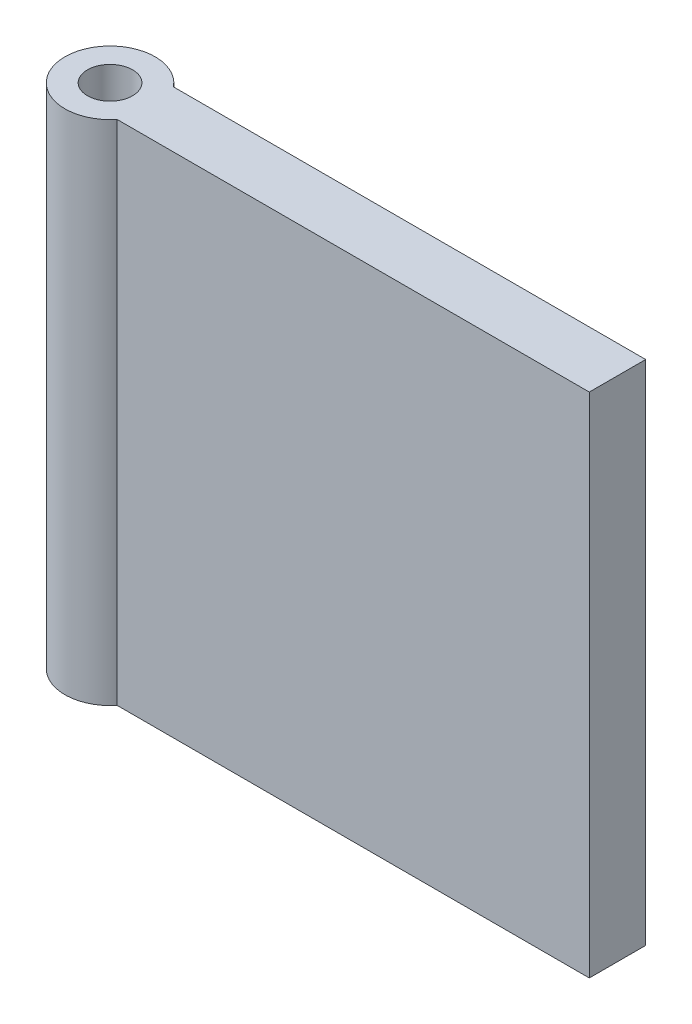
ISO-10303-21;
HEADER;
FILE_DESCRIPTION(('STEP AP214'),'2;1');
FILE_NAME('part.step','',(''),(''),'','','');
FILE_SCHEMA(('AUTOMOTIVE_DESIGN { 1 0 10303 214 1 1 1 1 }'));
ENDSEC;
DATA;
#1=APPLICATION_CONTEXT('core data for automotive mechanical design processes');
#2=APPLICATION_PROTOCOL_DEFINITION('international standard','automotive_design',2000,#1);
#3=PRODUCT_CONTEXT('',#1,'mechanical');
#4=PRODUCT('Part','Part','',(#3));
#5=PRODUCT_RELATED_PRODUCT_CATEGORY('part','',(#4));
#6=PRODUCT_DEFINITION_FORMATION('','',#4);
#7=PRODUCT_DEFINITION_CONTEXT('part definition',#1,'design');
#8=PRODUCT_DEFINITION('design','',#6,#7);
#9=PRODUCT_DEFINITION_SHAPE('','',#8);
#10=(LENGTH_UNIT() NAMED_UNIT(*) SI_UNIT(.MILLI.,.METRE.));
#11=(NAMED_UNIT(*) PLANE_ANGLE_UNIT() SI_UNIT($,.RADIAN.));
#12=(NAMED_UNIT(*) SI_UNIT($,.STERADIAN.) SOLID_ANGLE_UNIT());
#13=UNCERTAINTY_MEASURE_WITH_UNIT(LENGTH_MEASURE(1.E-05),#10,'distance_accuracy_value','');
#14=(GEOMETRIC_REPRESENTATION_CONTEXT(3) GLOBAL_UNCERTAINTY_ASSIGNED_CONTEXT((#13)) GLOBAL_UNIT_ASSIGNED_CONTEXT((#10,
#11,#12)) REPRESENTATION_CONTEXT('',''));
#15=CARTESIAN_POINT('',(0.,0.,0.));
#16=DIRECTION('',(0.,0.,1.));
#17=DIRECTION('',(1.,0.,0.));
#18=AXIS2_PLACEMENT_3D('',#15,#16,#17);
#19=CARTESIAN_POINT('',(0.,45.,-2.5));
#20=DIRECTION('',(0.,0.,1.));
#21=DIRECTION('',(1.,0.,0.));
#22=AXIS2_PLACEMENT_3D('',#19,#20,#21);
#23=PLANE('',#22);
#24=DIRECTION('',(-1.,0.,0.));
#25=VECTOR('',#24,1.);
#26=CARTESIAN_POINT('',(0.,0.,-2.5));
#27=LINE('',#26,#25);
#28=CARTESIAN_POINT('',(45.,0.,-2.50000000000001));
#29=VERTEX_POINT('',#28);
#30=CARTESIAN_POINT('',(3.1224989991992,0.,-2.5));
#31=VERTEX_POINT('',#30);
#32=EDGE_CURVE('E98',#29,#31,#27,.T.);
#33=ORIENTED_EDGE('',*,*,#32,.T.);
#34=DIRECTION('',(0.,-1.,0.));
#35=VECTOR('',#34,1.);
#36=CARTESIAN_POINT('',(3.1224989991992,45.,-2.5));
#37=LINE('',#36,#35);
#38=CARTESIAN_POINT('',(3.1224989991992,45.,-2.5));
#39=VERTEX_POINT('',#38);
#40=EDGE_CURVE('E11',#39,#31,#37,.T.);
#41=ORIENTED_EDGE('',*,*,#40,.F.);
#42=DIRECTION('',(-1.,0.,0.));
#43=VECTOR('',#42,1.);
#44=CARTESIAN_POINT('',(0.,45.,-2.5));
#45=LINE('',#44,#43);
#46=CARTESIAN_POINT('',(45.,45.,-2.50000000000001));
#47=VERTEX_POINT('',#46);
#48=EDGE_CURVE('E83',#47,#39,#45,.T.);
#49=ORIENTED_EDGE('',*,*,#48,.F.);
#50=DIRECTION('',(0.,-1.,0.));
#51=VECTOR('',#50,1.);
#52=CARTESIAN_POINT('',(45.,45.,-2.50000000000001));
#53=LINE('',#52,#51);
#54=EDGE_CURVE('E94',#47,#29,#53,.T.);
#55=ORIENTED_EDGE('',*,*,#54,.T.);
#56=EDGE_LOOP('',(#33,#41,#49,#55));
#57=FACE_BOUND('',#56,.T.);
#58=ADVANCED_FACE('F36',(#57),#23,.F.);
#59=CARTESIAN_POINT('',(0.,45.,0.));
#60=DIRECTION('',(0.,-1.,0.));
#61=DIRECTION('',(0.,0.,-1.));
#62=AXIS2_PLACEMENT_3D('',#59,#60,#61);
#63=CYLINDRICAL_SURFACE('',#62,4.);
#64=CARTESIAN_POINT('',(0.,0.,0.));
#65=DIRECTION('',(0.,1.,0.));
#66=DIRECTION('',(0.,0.,1.));
#67=AXIS2_PLACEMENT_3D('',#64,#65,#66);
#68=CIRCLE('',#67,4.);
#69=CARTESIAN_POINT('',(3.1224989991992,0.,2.5));
#70=VERTEX_POINT('',#69);
#71=EDGE_CURVE('E88',#31,#70,#68,.T.);
#72=ORIENTED_EDGE('',*,*,#71,.T.);
#73=DIRECTION('',(0.,-1.,0.));
#74=VECTOR('',#73,1.);
#75=CARTESIAN_POINT('',(3.1224989991992,45.,2.5));
#76=LINE('',#75,#74);
#77=CARTESIAN_POINT('',(3.1224989991992,45.,2.5));
#78=VERTEX_POINT('',#77);
#79=EDGE_CURVE('E44',#78,#70,#76,.T.);
#80=ORIENTED_EDGE('',*,*,#79,.F.);
#81=CARTESIAN_POINT('',(0.,45.,0.));
#82=DIRECTION('',(0.,1.,0.));
#83=DIRECTION('',(0.,0.,1.));
#84=AXIS2_PLACEMENT_3D('',#81,#82,#83);
#85=CIRCLE('',#84,4.);
#86=EDGE_CURVE('E78',#39,#78,#85,.T.);
#87=ORIENTED_EDGE('',*,*,#86,.F.);
#88=ORIENTED_EDGE('',*,*,#40,.T.);
#89=EDGE_LOOP('',(#72,#80,#87,#88));
#90=FACE_BOUND('',#89,.T.);
#91=ADVANCED_FACE('F87',(#90),#63,.T.);
#92=CARTESIAN_POINT('',(0.,45.,2.5));
#93=DIRECTION('',(0.,0.,1.));
#94=DIRECTION('',(1.,0.,0.));
#95=AXIS2_PLACEMENT_3D('',#92,#93,#94);
#96=PLANE('',#95);
#97=DIRECTION('',(-1.,0.,0.));
#98=VECTOR('',#97,1.);
#99=CARTESIAN_POINT('',(0.,0.,2.5));
#100=LINE('',#99,#98);
#101=CARTESIAN_POINT('',(45.,0.,2.49999999999999));
#102=VERTEX_POINT('',#101);
#103=EDGE_CURVE('E103',#102,#70,#100,.T.);
#104=ORIENTED_EDGE('',*,*,#103,.F.);
#105=DIRECTION('',(0.,-1.,0.));
#106=VECTOR('',#105,1.);
#107=CARTESIAN_POINT('',(45.,45.,2.49999999999999));
#108=LINE('',#107,#106);
#109=CARTESIAN_POINT('',(45.,45.,2.49999999999999));
#110=VERTEX_POINT('',#109);
#111=EDGE_CURVE('E68',#110,#102,#108,.T.);
#112=ORIENTED_EDGE('',*,*,#111,.F.);
#113=DIRECTION('',(-1.,0.,0.));
#114=VECTOR('',#113,1.);
#115=CARTESIAN_POINT('',(0.,45.,2.5));
#116=LINE('',#115,#114);
#117=EDGE_CURVE('E81',#110,#78,#116,.T.);
#118=ORIENTED_EDGE('',*,*,#117,.T.);
#119=ORIENTED_EDGE('',*,*,#79,.T.);
#120=EDGE_LOOP('',(#104,#112,#118,#119));
#121=FACE_BOUND('',#120,.T.);
#122=ADVANCED_FACE('F92',(#121),#96,.T.);
#123=CARTESIAN_POINT('',(45.,45.,0.));
#124=DIRECTION('',(-1.,0.,0.));
#125=DIRECTION('',(0.,0.,1.));
#126=AXIS2_PLACEMENT_3D('',#123,#124,#125);
#127=PLANE('',#126);
#128=DIRECTION('',(0.,0.,-1.));
#129=VECTOR('',#128,1.);
#130=CARTESIAN_POINT('',(45.,0.,0.));
#131=LINE('',#130,#129);
#132=EDGE_CURVE('E71',#102,#29,#131,.T.);
#133=ORIENTED_EDGE('',*,*,#132,.T.);
#134=ORIENTED_EDGE('',*,*,#54,.F.);
#135=DIRECTION('',(0.,0.,-1.));
#136=VECTOR('',#135,1.);
#137=CARTESIAN_POINT('',(45.,45.,0.));
#138=LINE('',#137,#136);
#139=EDGE_CURVE('E52',#110,#47,#138,.T.);
#140=ORIENTED_EDGE('',*,*,#139,.F.);
#141=ORIENTED_EDGE('',*,*,#111,.T.);
#142=EDGE_LOOP('',(#133,#134,#140,#141));
#143=FACE_BOUND('',#142,.T.);
#144=ADVANCED_FACE('F121',(#143),#127,.F.);
#145=CARTESIAN_POINT('',(0.,45.,0.));
#146=DIRECTION('',(0.,1.,0.));
#147=DIRECTION('',(0.,0.,1.));
#148=AXIS2_PLACEMENT_3D('',#145,#146,#147);
#149=PLANE('',#148);
#150=CARTESIAN_POINT('',(0.,45.,0.));
#151=DIRECTION('',(0.,1.,0.));
#152=DIRECTION('',(0.,0.,1.));
#153=AXIS2_PLACEMENT_3D('',#150,#151,#152);
#154=CIRCLE('',#153,2.);
#155=CARTESIAN_POINT('',(0.,45.,2.));
#156=VERTEX_POINT('',#155);
#157=EDGE_CURVE('E184',#156,#156,#154,.T.);
#158=ORIENTED_EDGE('',*,*,#157,.F.);
#159=EDGE_LOOP('',(#158));
#160=FACE_BOUND('',#159,.T.);
#161=ORIENTED_EDGE('',*,*,#48,.T.);
#162=ORIENTED_EDGE('',*,*,#86,.T.);
#163=ORIENTED_EDGE('',*,*,#117,.F.);
#164=ORIENTED_EDGE('',*,*,#139,.T.);
#165=EDGE_LOOP('',(#161,#162,#163,#164));
#166=FACE_BOUND('',#165,.T.);
#167=ADVANCED_FACE('F79',(#160,#166),#149,.T.);
#168=CARTESIAN_POINT('',(0.,0.,0.));
#169=DIRECTION('',(0.,1.,0.));
#170=DIRECTION('',(0.,0.,1.));
#171=AXIS2_PLACEMENT_3D('',#168,#169,#170);
#172=PLANE('',#171);
#173=CARTESIAN_POINT('',(0.,0.,0.));
#174=DIRECTION('',(0.,1.,0.));
#175=DIRECTION('',(0.,0.,1.));
#176=AXIS2_PLACEMENT_3D('',#173,#174,#175);
#177=CIRCLE('',#176,2.);
#178=CARTESIAN_POINT('',(0.,0.,2.));
#179=VERTEX_POINT('',#178);
#180=EDGE_CURVE('E101',#179,#179,#177,.T.);
#181=ORIENTED_EDGE('',*,*,#180,.T.);
#182=EDGE_LOOP('',(#181));
#183=FACE_BOUND('',#182,.T.);
#184=ORIENTED_EDGE('',*,*,#32,.F.);
#185=ORIENTED_EDGE('',*,*,#132,.F.);
#186=ORIENTED_EDGE('',*,*,#103,.T.);
#187=ORIENTED_EDGE('',*,*,#71,.F.);
#188=EDGE_LOOP('',(#184,#185,#186,#187));
#189=FACE_BOUND('',#188,.T.);
#190=ADVANCED_FACE('F110',(#183,#189),#172,.F.);
#191=CARTESIAN_POINT('',(0.,0.,0.));
#192=DIRECTION('',(0.,1.,0.));
#193=DIRECTION('',(0.,0.,1.));
#194=AXIS2_PLACEMENT_3D('',#191,#192,#193);
#195=CYLINDRICAL_SURFACE('',#194,2.);
#196=CARTESIAN_POINT('',(0.,0.,2.));
#197=CARTESIAN_POINT('',(0.,0.468749999999999,2.));
#198=CARTESIAN_POINT('',(0.,0.9375,2.));
#199=CARTESIAN_POINT('',(0.,1.875,2.));
#200=CARTESIAN_POINT('',(0.,2.34375,2.));
#201=CARTESIAN_POINT('',(0.,3.28125,2.));
#202=CARTESIAN_POINT('',(0.,3.75,2.));
#203=CARTESIAN_POINT('',(0.,4.6875,2.));
#204=CARTESIAN_POINT('',(0.,5.15625,2.));
#205=CARTESIAN_POINT('',(0.,6.09375,2.));
#206=CARTESIAN_POINT('',(0.,6.5625,2.));
#207=CARTESIAN_POINT('',(0.,7.5,2.));
#208=CARTESIAN_POINT('',(0.,7.96875,2.));
#209=CARTESIAN_POINT('',(0.,8.90625,2.));
#210=CARTESIAN_POINT('',(0.,9.375,2.));
#211=CARTESIAN_POINT('',(0.,10.3125,2.));
#212=CARTESIAN_POINT('',(0.,10.78125,2.));
#213=CARTESIAN_POINT('',(0.,11.71875,2.));
#214=CARTESIAN_POINT('',(0.,12.1875,2.));
#215=CARTESIAN_POINT('',(0.,13.125,2.));
#216=CARTESIAN_POINT('',(0.,13.59375,2.));
#217=CARTESIAN_POINT('',(0.,14.53125,2.));
#218=CARTESIAN_POINT('',(0.,15.,2.));
#219=CARTESIAN_POINT('',(0.,15.9375,2.));
#220=CARTESIAN_POINT('',(0.,16.40625,2.));
#221=CARTESIAN_POINT('',(0.,17.34375,2.));
#222=CARTESIAN_POINT('',(0.,17.8125,2.));
#223=CARTESIAN_POINT('',(0.,18.75,2.));
#224=CARTESIAN_POINT('',(0.,19.21875,2.));
#225=CARTESIAN_POINT('',(0.,20.15625,2.));
#226=CARTESIAN_POINT('',(0.,20.625,2.));
#227=CARTESIAN_POINT('',(0.,21.5625,2.));
#228=CARTESIAN_POINT('',(0.,22.03125,2.));
#229=CARTESIAN_POINT('',(0.,22.96875,2.));
#230=CARTESIAN_POINT('',(0.,23.4375,2.));
#231=CARTESIAN_POINT('',(0.,24.375,2.));
#232=CARTESIAN_POINT('',(0.,24.84375,2.));
#233=CARTESIAN_POINT('',(0.,25.78125,2.));
#234=CARTESIAN_POINT('',(0.,26.25,2.));
#235=CARTESIAN_POINT('',(0.,27.1875,2.));
#236=CARTESIAN_POINT('',(0.,27.65625,2.));
#237=CARTESIAN_POINT('',(0.,28.59375,2.));
#238=CARTESIAN_POINT('',(0.,29.0625,2.));
#239=CARTESIAN_POINT('',(0.,30.,2.));
#240=CARTESIAN_POINT('',(0.,30.46875,2.));
#241=CARTESIAN_POINT('',(0.,31.40625,2.));
#242=CARTESIAN_POINT('',(0.,31.875,2.));
#243=CARTESIAN_POINT('',(0.,32.8125,2.));
#244=CARTESIAN_POINT('',(0.,33.28125,2.));
#245=CARTESIAN_POINT('',(0.,34.21875,2.));
#246=CARTESIAN_POINT('',(0.,34.6875,2.));
#247=CARTESIAN_POINT('',(0.,35.625,2.));
#248=CARTESIAN_POINT('',(0.,36.09375,2.));
#249=CARTESIAN_POINT('',(0.,37.03125,2.));
#250=CARTESIAN_POINT('',(0.,37.5,2.));
#251=CARTESIAN_POINT('',(0.,38.4375,2.));
#252=CARTESIAN_POINT('',(0.,38.90625,2.));
#253=CARTESIAN_POINT('',(0.,39.84375,2.));
#254=CARTESIAN_POINT('',(0.,40.3125,2.));
#255=CARTESIAN_POINT('',(0.,41.25,2.));
#256=CARTESIAN_POINT('',(0.,41.71875,2.));
#257=CARTESIAN_POINT('',(0.,42.65625,2.));
#258=CARTESIAN_POINT('',(0.,43.125,2.));
#259=CARTESIAN_POINT('',(0.,44.0625,2.));
#260=CARTESIAN_POINT('',(0.,44.53125,2.));
#261=CARTESIAN_POINT('',(0.,45.,2.));
#262=B_SPLINE_CURVE_WITH_KNOTS('',3,(#196,#197,#198,#199,#200,#201,#202,#203,#204,#205,#206,
#207,#208,#209,#210,#211,#212,#213,#214,#215,#216,#217,#218,#219,#220,#221,#222,#223,#224,#225,
#226,#227,#228,#229,#230,#231,#232,#233,#234,#235,#236,#237,#238,#239,#240,#241,#242,#243,#244,
#245,#246,#247,#248,#249,#250,#251,#252,#253,#254,#255,#256,#257,#258,#259,#260,#261),
.UNSPECIFIED.,.F.,.F.,(4,2,2,2,2,2,2,2,2,2,2,2,2,2,2,2,2,2,2,2,2,2,2,2,2,2,2,2,2,2,2,2,4),(0.,
1.40625,2.8125,4.21875,5.625,7.03125,8.4375,9.84375,11.25,12.65625,14.0625,15.46875,16.875,
18.28125,19.6875,21.09375,22.5,23.90625,25.3125,26.71875,28.125,29.53125,30.9375,32.34375,33.75,
35.15625,36.5625,37.96875,39.375,40.78125,42.1875,43.59375,45.),.UNSPECIFIED.);
#263=EDGE_CURVE('BSEAM112',#179,#156,#262,.T.);
#264=ORIENTED_EDGE('',*,*,#180,.F.);
#265=ORIENTED_EDGE('',*,*,#157,.T.);
#266=ORIENTED_EDGE('',*,*,#263,.T.);
#267=ORIENTED_EDGE('',*,*,#263,.F.);
#268=EDGE_LOOP('',(#264,#266,#265,#267));
#269=FACE_BOUND('',#268,.T.);
#270=ADVANCED_FACE('F112',(#269),#195,.F.);
#271=CLOSED_SHELL('',(#58,#91,#122,#144,#167,#190,#270));
#272=MANIFOLD_SOLID_BREP('B2',#271);
#273=ADVANCED_BREP_SHAPE_REPRESENTATION('',(#18,#272),#14);
#274=SHAPE_DEFINITION_REPRESENTATION(#9,#273);
ENDSEC;
END-ISO-10303-21;
